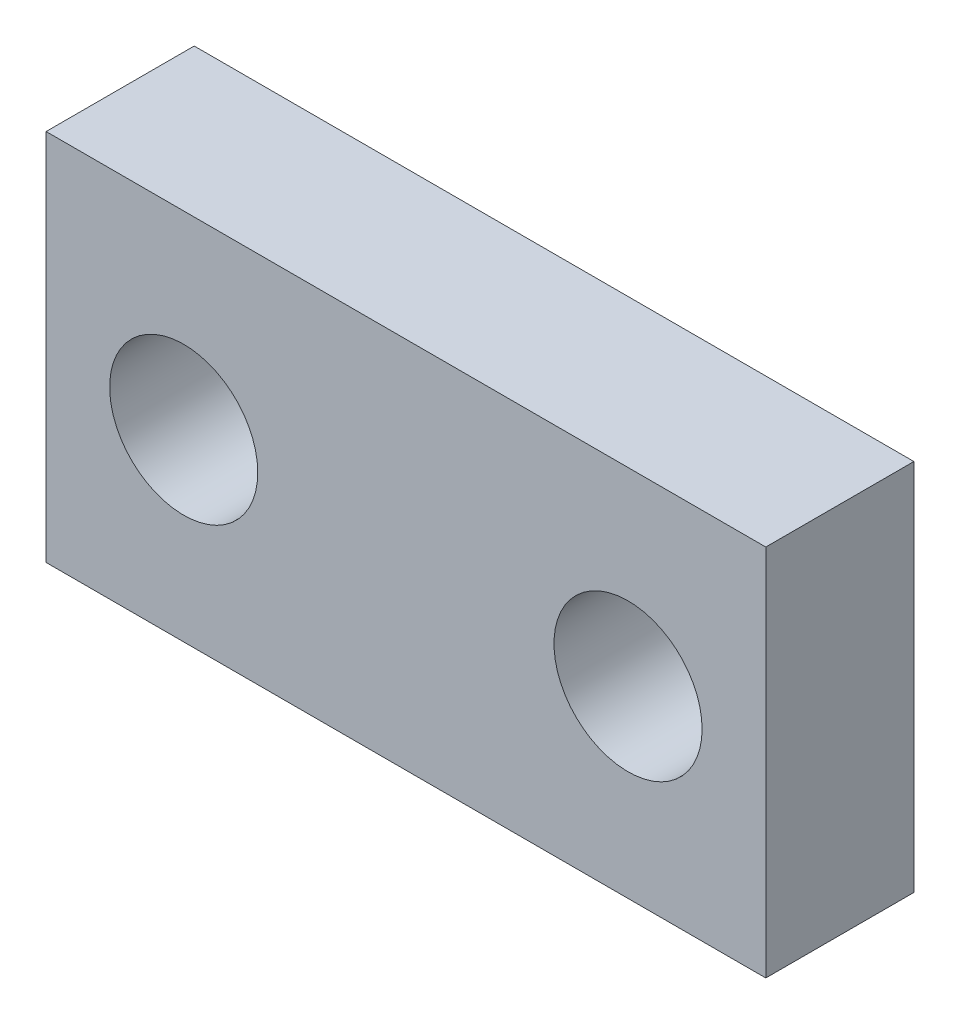
ISO-10303-21;
HEADER;
FILE_DESCRIPTION(('STEP AP214'),'2;1');
FILE_NAME('part.step','',(''),(''),'','','');
FILE_SCHEMA(('AUTOMOTIVE_DESIGN { 1 0 10303 214 1 1 1 1 }'));
ENDSEC;
DATA;
#1=APPLICATION_CONTEXT('core data for automotive mechanical design processes');
#2=APPLICATION_PROTOCOL_DEFINITION('international standard','automotive_design',2000,#1);
#3=PRODUCT_CONTEXT('',#1,'mechanical');
#4=PRODUCT('Part','Part','',(#3));
#5=PRODUCT_RELATED_PRODUCT_CATEGORY('part','',(#4));
#6=PRODUCT_DEFINITION_FORMATION('','',#4);
#7=PRODUCT_DEFINITION_CONTEXT('part definition',#1,'design');
#8=PRODUCT_DEFINITION('design','',#6,#7);
#9=PRODUCT_DEFINITION_SHAPE('','',#8);
#10=(LENGTH_UNIT() NAMED_UNIT(*) SI_UNIT(.MILLI.,.METRE.));
#11=(NAMED_UNIT(*) PLANE_ANGLE_UNIT() SI_UNIT($,.RADIAN.));
#12=(NAMED_UNIT(*) SI_UNIT($,.STERADIAN.) SOLID_ANGLE_UNIT());
#13=UNCERTAINTY_MEASURE_WITH_UNIT(LENGTH_MEASURE(1.E-05),#10,'distance_accuracy_value','');
#14=(GEOMETRIC_REPRESENTATION_CONTEXT(3) GLOBAL_UNCERTAINTY_ASSIGNED_CONTEXT((#13)) GLOBAL_UNIT_ASSIGNED_CONTEXT((#10,
#11,#12)) REPRESENTATION_CONTEXT('',''));
#15=CARTESIAN_POINT('',(0.,0.,0.));
#16=DIRECTION('',(0.,0.,1.));
#17=DIRECTION('',(1.,0.,0.));
#18=AXIS2_PLACEMENT_3D('',#15,#16,#17);
#19=CARTESIAN_POINT('',(0.,0.,5.));
#20=DIRECTION('',(0.,0.,1.));
#21=DIRECTION('',(1.,0.,0.));
#22=AXIS2_PLACEMENT_3D('',#19,#20,#21);
#23=PLANE('',#22);
#24=CARTESIAN_POINT('',(20.8398537734605,-5.26964260720453,5.));
#25=DIRECTION('',(0.,0.,1.));
#26=DIRECTION('',(1.,0.,0.));
#27=AXIS2_PLACEMENT_3D('',#24,#25,#26);
#28=CIRCLE('',#27,2.5);
#29=CARTESIAN_POINT('',(23.3398537734605,-5.26964260720453,5.));
#30=VERTEX_POINT('',#29);
#31=EDGE_CURVE('E99',#30,#30,#28,.T.);
#32=ORIENTED_EDGE('',*,*,#31,.F.);
#33=EDGE_LOOP('',(#32));
#34=FACE_BOUND('',#33,.T.);
#35=DIRECTION('',(0.,-1.,0.));
#36=VECTOR('',#35,1.);
#37=CARTESIAN_POINT('',(1.19460478383748,1.12721916732129,5.));
#38=LINE('',#37,#36);
#39=CARTESIAN_POINT('',(1.19460478383748,1.12721916732129,5.));
#40=VERTEX_POINT('',#39);
#41=CARTESIAN_POINT('',(1.19460478383748,-11.4727808326787,5.));
#42=VERTEX_POINT('',#41);
#43=EDGE_CURVE('E84',#40,#42,#38,.T.);
#44=ORIENTED_EDGE('',*,*,#43,.T.);
#45=DIRECTION('',(1.,0.,0.));
#46=VECTOR('',#45,1.);
#47=CARTESIAN_POINT('',(1.19460478383748,-11.4727808326787,5.));
#48=LINE('',#47,#46);
#49=CARTESIAN_POINT('',(25.4898537734605,-11.4727808326787,5.));
#50=VERTEX_POINT('',#49);
#51=EDGE_CURVE('E79',#42,#50,#48,.T.);
#52=ORIENTED_EDGE('',*,*,#51,.T.);
#53=DIRECTION('',(0.,1.,0.));
#54=VECTOR('',#53,1.);
#55=CARTESIAN_POINT('',(25.4898537734605,1.12721916732129,5.));
#56=LINE('',#55,#54);
#57=CARTESIAN_POINT('',(25.4898537734605,1.12721916732129,5.));
#58=VERTEX_POINT('',#57);
#59=EDGE_CURVE('E82',#50,#58,#56,.T.);
#60=ORIENTED_EDGE('',*,*,#59,.T.);
#61=DIRECTION('',(-1.,0.,0.));
#62=VECTOR('',#61,1.);
#63=CARTESIAN_POINT('',(1.19460478383748,1.12721916732129,5.));
#64=LINE('',#63,#62);
#65=EDGE_CURVE('E49',#58,#40,#64,.T.);
#66=ORIENTED_EDGE('',*,*,#65,.T.);
#67=EDGE_LOOP('',(#44,#52,#60,#66));
#68=FACE_BOUND('',#67,.T.);
#69=CARTESIAN_POINT('',(5.83985377346047,-5.26964260720453,5.));
#70=DIRECTION('',(0.,0.,1.));
#71=DIRECTION('',(1.,0.,0.));
#72=AXIS2_PLACEMENT_3D('',#69,#70,#71);
#73=CIRCLE('',#72,2.5);
#74=CARTESIAN_POINT('',(8.33985377346048,-5.26964260720453,5.));
#75=VERTEX_POINT('',#74);
#76=EDGE_CURVE('E114',#75,#75,#73,.T.);
#77=ORIENTED_EDGE('',*,*,#76,.F.);
#78=EDGE_LOOP('',(#77));
#79=FACE_BOUND('',#78,.T.);
#80=ADVANCED_FACE('F32',(#34,#68,#79),#23,.T.);
#81=CARTESIAN_POINT('',(0.,0.,0.));
#82=DIRECTION('',(0.,0.,1.));
#83=DIRECTION('',(1.,0.,0.));
#84=AXIS2_PLACEMENT_3D('',#81,#82,#83);
#85=PLANE('',#84);
#86=DIRECTION('',(0.,-1.,0.));
#87=VECTOR('',#86,1.);
#88=CARTESIAN_POINT('',(1.19460478383748,1.12721916732129,0.));
#89=LINE('',#88,#87);
#90=CARTESIAN_POINT('',(1.19460478383748,1.12721916732129,0.));
#91=VERTEX_POINT('',#90);
#92=CARTESIAN_POINT('',(1.19460478383748,-11.4727808326787,0.));
#93=VERTEX_POINT('',#92);
#94=EDGE_CURVE('E96',#91,#93,#89,.T.);
#95=ORIENTED_EDGE('',*,*,#94,.F.);
#96=DIRECTION('',(-1.,0.,0.));
#97=VECTOR('',#96,1.);
#98=CARTESIAN_POINT('',(1.19460478383748,1.12721916732129,0.));
#99=LINE('',#98,#97);
#100=CARTESIAN_POINT('',(25.4898537734605,1.12721916732129,0.));
#101=VERTEX_POINT('',#100);
#102=EDGE_CURVE('E72',#101,#91,#99,.T.);
#103=ORIENTED_EDGE('',*,*,#102,.F.);
#104=DIRECTION('',(0.,1.,0.));
#105=VECTOR('',#104,1.);
#106=CARTESIAN_POINT('',(25.4898537734605,1.12721916732129,0.));
#107=LINE('',#106,#105);
#108=CARTESIAN_POINT('',(25.4898537734605,-11.4727808326787,0.));
#109=VERTEX_POINT('',#108);
#110=EDGE_CURVE('E66',#109,#101,#107,.T.);
#111=ORIENTED_EDGE('',*,*,#110,.F.);
#112=DIRECTION('',(1.,0.,0.));
#113=VECTOR('',#112,1.);
#114=CARTESIAN_POINT('',(1.19460478383748,-11.4727808326787,0.));
#115=LINE('',#114,#113);
#116=EDGE_CURVE('E88',#93,#109,#115,.T.);
#117=ORIENTED_EDGE('',*,*,#116,.F.);
#118=EDGE_LOOP('',(#95,#103,#111,#117));
#119=FACE_BOUND('',#118,.T.);
#120=CARTESIAN_POINT('',(20.8398537734605,-5.26964260720453,0.));
#121=DIRECTION('',(0.,0.,1.));
#122=DIRECTION('',(1.,0.,0.));
#123=AXIS2_PLACEMENT_3D('',#120,#121,#122);
#124=CIRCLE('',#123,2.5);
#125=CARTESIAN_POINT('',(23.3398537734605,-5.26964260720453,0.));
#126=VERTEX_POINT('',#125);
#127=EDGE_CURVE('E111',#126,#126,#124,.T.);
#128=ORIENTED_EDGE('',*,*,#127,.T.);
#129=EDGE_LOOP('',(#128));
#130=FACE_BOUND('',#129,.T.);
#131=CARTESIAN_POINT('',(5.83985377346047,-5.26964260720453,0.));
#132=DIRECTION('',(0.,0.,1.));
#133=DIRECTION('',(1.,0.,0.));
#134=AXIS2_PLACEMENT_3D('',#131,#132,#133);
#135=CIRCLE('',#134,2.5);
#136=CARTESIAN_POINT('',(8.33985377346048,-5.26964260720453,0.));
#137=VERTEX_POINT('',#136);
#138=EDGE_CURVE('E117',#137,#137,#135,.T.);
#139=ORIENTED_EDGE('',*,*,#138,.T.);
#140=EDGE_LOOP('',(#139));
#141=FACE_BOUND('',#140,.T.);
#142=ADVANCED_FACE('F107',(#119,#130,#141),#85,.F.);
#143=CARTESIAN_POINT('',(1.19460478383748,1.12721916732129,5.));
#144=DIRECTION('',(1.,0.,0.));
#145=DIRECTION('',(0.,0.,-1.));
#146=AXIS2_PLACEMENT_3D('',#143,#144,#145);
#147=PLANE('',#146);
#148=ORIENTED_EDGE('',*,*,#94,.T.);
#149=DIRECTION('',(0.,0.,-1.));
#150=VECTOR('',#149,1.);
#151=CARTESIAN_POINT('',(1.19460478383748,-11.4727808326787,5.));
#152=LINE('',#151,#150);
#153=EDGE_CURVE('E11',#42,#93,#152,.T.);
#154=ORIENTED_EDGE('',*,*,#153,.F.);
#155=ORIENTED_EDGE('',*,*,#43,.F.);
#156=DIRECTION('',(0.,0.,-1.));
#157=VECTOR('',#156,1.);
#158=CARTESIAN_POINT('',(1.19460478383748,1.12721916732129,5.));
#159=LINE('',#158,#157);
#160=EDGE_CURVE('E92',#40,#91,#159,.T.);
#161=ORIENTED_EDGE('',*,*,#160,.T.);
#162=EDGE_LOOP('',(#148,#154,#155,#161));
#163=FACE_BOUND('',#162,.T.);
#164=ADVANCED_FACE('F34',(#163),#147,.F.);
#165=CARTESIAN_POINT('',(1.19460478383748,-11.4727808326787,5.));
#166=DIRECTION('',(0.,1.,0.));
#167=DIRECTION('',(0.,0.,1.));
#168=AXIS2_PLACEMENT_3D('',#165,#166,#167);
#169=PLANE('',#168);
#170=ORIENTED_EDGE('',*,*,#116,.T.);
#171=DIRECTION('',(0.,0.,-1.));
#172=VECTOR('',#171,1.);
#173=CARTESIAN_POINT('',(25.4898537734605,-11.4727808326787,5.));
#174=LINE('',#173,#172);
#175=EDGE_CURVE('E41',#50,#109,#174,.T.);
#176=ORIENTED_EDGE('',*,*,#175,.F.);
#177=ORIENTED_EDGE('',*,*,#51,.F.);
#178=ORIENTED_EDGE('',*,*,#153,.T.);
#179=EDGE_LOOP('',(#170,#176,#177,#178));
#180=FACE_BOUND('',#179,.T.);
#181=ADVANCED_FACE('F87',(#180),#169,.F.);
#182=CARTESIAN_POINT('',(25.4898537734605,1.12721916732129,5.));
#183=DIRECTION('',(-1.,0.,0.));
#184=DIRECTION('',(0.,0.,1.));
#185=AXIS2_PLACEMENT_3D('',#182,#183,#184);
#186=PLANE('',#185);
#187=ORIENTED_EDGE('',*,*,#110,.T.);
#188=DIRECTION('',(0.,0.,-1.));
#189=VECTOR('',#188,1.);
#190=CARTESIAN_POINT('',(25.4898537734605,1.12721916732129,5.));
#191=LINE('',#190,#189);
#192=EDGE_CURVE('E89',#58,#101,#191,.T.);
#193=ORIENTED_EDGE('',*,*,#192,.F.);
#194=ORIENTED_EDGE('',*,*,#59,.F.);
#195=ORIENTED_EDGE('',*,*,#175,.T.);
#196=EDGE_LOOP('',(#187,#193,#194,#195));
#197=FACE_BOUND('',#196,.T.);
#198=ADVANCED_FACE('F90',(#197),#186,.F.);
#199=CARTESIAN_POINT('',(1.19460478383748,1.12721916732129,5.));
#200=DIRECTION('',(0.,-1.,0.));
#201=DIRECTION('',(0.,0.,-1.));
#202=AXIS2_PLACEMENT_3D('',#199,#200,#201);
#203=PLANE('',#202);
#204=ORIENTED_EDGE('',*,*,#102,.T.);
#205=ORIENTED_EDGE('',*,*,#160,.F.);
#206=ORIENTED_EDGE('',*,*,#65,.F.);
#207=ORIENTED_EDGE('',*,*,#192,.T.);
#208=EDGE_LOOP('',(#204,#205,#206,#207));
#209=FACE_BOUND('',#208,.T.);
#210=ADVANCED_FACE('F104',(#209),#203,.F.);
#211=CARTESIAN_POINT('',(20.8398537734605,-5.26964260720453,5.));
#212=DIRECTION('',(0.,0.,-1.));
#213=DIRECTION('',(-1.,0.,0.));
#214=AXIS2_PLACEMENT_3D('',#211,#212,#213);
#215=CYLINDRICAL_SURFACE('',#214,2.5);
#216=ORIENTED_EDGE('',*,*,#31,.T.);
#217=EDGE_LOOP('',(#216));
#218=FACE_BOUND('',#217,.T.);
#219=ORIENTED_EDGE('',*,*,#127,.F.);
#220=EDGE_LOOP('',(#219));
#221=FACE_BOUND('',#220,.T.);
#222=ADVANCED_FACE('F134',(#218,#221),#215,.F.);
#223=CARTESIAN_POINT('',(5.83985377346047,-5.26964260720453,5.));
#224=DIRECTION('',(0.,0.,-1.));
#225=DIRECTION('',(-1.,0.,0.));
#226=AXIS2_PLACEMENT_3D('',#223,#224,#225);
#227=CYLINDRICAL_SURFACE('',#226,2.5);
#228=ORIENTED_EDGE('',*,*,#76,.T.);
#229=EDGE_LOOP('',(#228));
#230=FACE_BOUND('',#229,.T.);
#231=ORIENTED_EDGE('',*,*,#138,.F.);
#232=EDGE_LOOP('',(#231));
#233=FACE_BOUND('',#232,.T.);
#234=ADVANCED_FACE('F123',(#230,#233),#227,.F.);
#235=CLOSED_SHELL('',(#80,#142,#164,#181,#198,#210,#222,#234));
#236=MANIFOLD_SOLID_BREP('B2',#235);
#237=ADVANCED_BREP_SHAPE_REPRESENTATION('',(#18,#236),#14);
#238=SHAPE_DEFINITION_REPRESENTATION(#9,#237);
ENDSEC;
END-ISO-10303-21;
